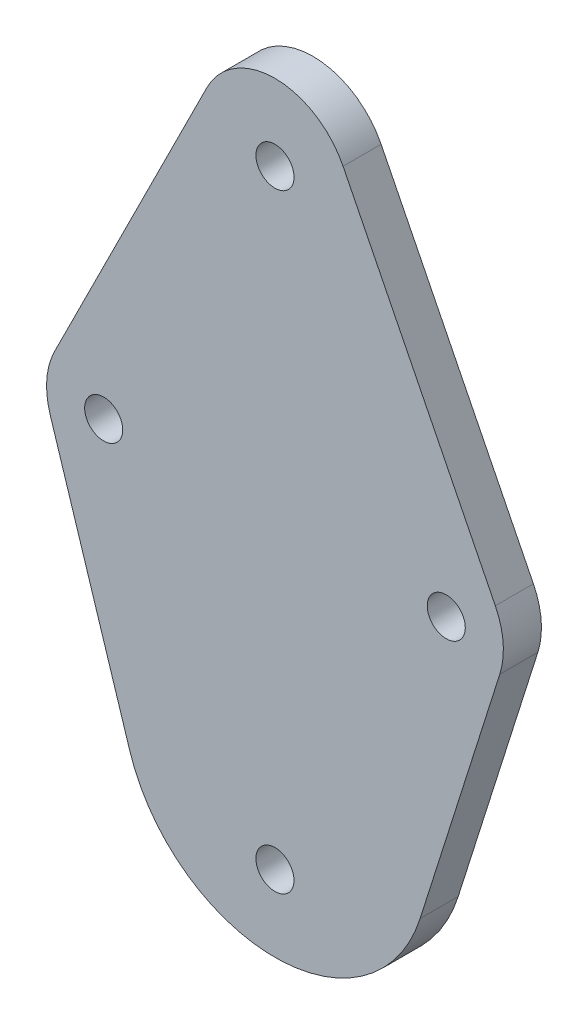
ISO-10303-21;
HEADER;
FILE_DESCRIPTION(('STEP AP214'),'2;1');
FILE_NAME('part.step','',(''),(''),'','','');
FILE_SCHEMA(('AUTOMOTIVE_DESIGN { 1 0 10303 214 1 1 1 1 }'));
ENDSEC;
DATA;
#1=APPLICATION_CONTEXT('core data for automotive mechanical design processes');
#2=APPLICATION_PROTOCOL_DEFINITION('international standard','automotive_design',2000,#1);
#3=PRODUCT_CONTEXT('',#1,'mechanical');
#4=PRODUCT('Part','Part','',(#3));
#5=PRODUCT_RELATED_PRODUCT_CATEGORY('part','',(#4));
#6=PRODUCT_DEFINITION_FORMATION('','',#4);
#7=PRODUCT_DEFINITION_CONTEXT('part definition',#1,'design');
#8=PRODUCT_DEFINITION('design','',#6,#7);
#9=PRODUCT_DEFINITION_SHAPE('','',#8);
#10=(LENGTH_UNIT() NAMED_UNIT(*) SI_UNIT(.MILLI.,.METRE.));
#11=(NAMED_UNIT(*) PLANE_ANGLE_UNIT() SI_UNIT($,.RADIAN.));
#12=(NAMED_UNIT(*) SI_UNIT($,.STERADIAN.) SOLID_ANGLE_UNIT());
#13=UNCERTAINTY_MEASURE_WITH_UNIT(LENGTH_MEASURE(1.E-05),#10,'distance_accuracy_value','');
#14=(GEOMETRIC_REPRESENTATION_CONTEXT(3) GLOBAL_UNCERTAINTY_ASSIGNED_CONTEXT((#13)) GLOBAL_UNIT_ASSIGNED_CONTEXT((#10,
#11,#12)) REPRESENTATION_CONTEXT('',''));
#15=CARTESIAN_POINT('',(0.,0.,0.));
#16=DIRECTION('',(0.,0.,1.));
#17=DIRECTION('',(1.,0.,0.));
#18=AXIS2_PLACEMENT_3D('',#15,#16,#17);
#19=CARTESIAN_POINT('',(0.,40.,5.));
#20=DIRECTION('',(0.,0.,-1.));
#21=DIRECTION('',(-1.,0.,0.));
#22=AXIS2_PLACEMENT_3D('',#19,#20,#21);
#23=CYLINDRICAL_SURFACE('',#22,10.);
#24=CARTESIAN_POINT('',(0.,40.,0.));
#25=DIRECTION('',(0.,0.,1.));
#26=DIRECTION('',(1.,0.,0.));
#27=AXIS2_PLACEMENT_3D('',#24,#25,#26);
#28=CIRCLE('',#27,10.);
#29=CARTESIAN_POINT('',(8.94427190999916,44.4721359549996,0.));
#30=VERTEX_POINT('',#29);
#31=CARTESIAN_POINT('',(-8.94427190999916,44.4721359549996,0.));
#32=VERTEX_POINT('',#31);
#33=EDGE_CURVE('E144',#30,#32,#28,.T.);
#34=ORIENTED_EDGE('',*,*,#33,.T.);
#35=DIRECTION('',(0.,0.,-1.));
#36=VECTOR('',#35,1.);
#37=CARTESIAN_POINT('',(-8.94427190999916,44.4721359549996,5.));
#38=LINE('',#37,#36);
#39=CARTESIAN_POINT('',(-8.94427190999916,44.4721359549996,5.));
#40=VERTEX_POINT('',#39);
#41=EDGE_CURVE('E11',#40,#32,#38,.T.);
#42=ORIENTED_EDGE('',*,*,#41,.F.);
#43=CARTESIAN_POINT('',(0.,40.,5.));
#44=DIRECTION('',(0.,0.,1.));
#45=DIRECTION('',(1.,0.,0.));
#46=AXIS2_PLACEMENT_3D('',#43,#44,#45);
#47=CIRCLE('',#46,10.);
#48=CARTESIAN_POINT('',(8.94427190999916,44.4721359549996,5.));
#49=VERTEX_POINT('',#48);
#50=EDGE_CURVE('E167',#49,#40,#47,.T.);
#51=ORIENTED_EDGE('',*,*,#50,.F.);
#52=DIRECTION('',(0.,0.,-1.));
#53=VECTOR('',#52,1.);
#54=CARTESIAN_POINT('',(8.94427190999916,44.4721359549996,5.));
#55=LINE('',#54,#53);
#56=EDGE_CURVE('E140',#49,#30,#55,.T.);
#57=ORIENTED_EDGE('',*,*,#56,.T.);
#58=EDGE_LOOP('',(#34,#42,#51,#57));
#59=FACE_BOUND('',#58,.T.);
#60=ADVANCED_FACE('F43',(#59),#23,.T.);
#61=CARTESIAN_POINT('',(-8.94427190999916,44.4721359549996,5.));
#62=DIRECTION('',(0.894427190999916,-0.447213595499958,0.));
#63=DIRECTION('',(0.447213595499958,0.894427190999916,0.));
#64=AXIS2_PLACEMENT_3D('',#61,#62,#63);
#65=PLANE('',#64);
#66=DIRECTION('',(-0.447213595499958,-0.894427190999916,0.));
#67=VECTOR('',#66,1.);
#68=CARTESIAN_POINT('',(-8.94427190999916,44.4721359549996,0.));
#69=LINE('',#68,#67);
#70=CARTESIAN_POINT('',(-28.9442719099992,4.47213595499958,0.));
#71=VERTEX_POINT('',#70);
#72=EDGE_CURVE('E148',#32,#71,#69,.T.);
#73=ORIENTED_EDGE('',*,*,#72,.T.);
#74=DIRECTION('',(0.,0.,-1.));
#75=VECTOR('',#74,1.);
#76=CARTESIAN_POINT('',(-28.9442719099992,4.47213595499958,5.));
#77=LINE('',#76,#75);
#78=CARTESIAN_POINT('',(-28.9442719099992,4.47213595499958,5.));
#79=VERTEX_POINT('',#78);
#80=EDGE_CURVE('E52',#79,#71,#77,.T.);
#81=ORIENTED_EDGE('',*,*,#80,.F.);
#82=DIRECTION('',(-0.447213595499958,-0.894427190999916,0.));
#83=VECTOR('',#82,1.);
#84=CARTESIAN_POINT('',(-8.94427190999916,44.4721359549996,5.));
#85=LINE('',#84,#83);
#86=EDGE_CURVE('E103',#40,#79,#85,.T.);
#87=ORIENTED_EDGE('',*,*,#86,.F.);
#88=ORIENTED_EDGE('',*,*,#41,.T.);
#89=EDGE_LOOP('',(#73,#81,#87,#88));
#90=FACE_BOUND('',#89,.T.);
#91=ADVANCED_FACE('F276',(#90),#65,.F.);
#92=CARTESIAN_POINT('',(-20.,0.,5.));
#93=DIRECTION('',(0.,0.,-1.));
#94=DIRECTION('',(-1.,0.,0.));
#95=AXIS2_PLACEMENT_3D('',#92,#93,#94);
#96=CYLINDRICAL_SURFACE('',#95,9.99999999999998);
#97=CARTESIAN_POINT('',(-20.,0.,0.));
#98=DIRECTION('',(0.,0.,1.));
#99=DIRECTION('',(1.,0.,0.));
#100=AXIS2_PLACEMENT_3D('',#97,#98,#99);
#101=CIRCLE('',#100,9.99999999999998);
#102=CARTESIAN_POINT('',(-29.5325421887794,-3.02169479251962,0.));
#103=VERTEX_POINT('',#102);
#104=EDGE_CURVE('E152',#71,#103,#101,.T.);
#105=ORIENTED_EDGE('',*,*,#104,.T.);
#106=DIRECTION('',(0.,0.,-1.));
#107=VECTOR('',#106,1.);
#108=CARTESIAN_POINT('',(-29.5325421887794,-3.02169479251962,5.));
#109=LINE('',#108,#107);
#110=CARTESIAN_POINT('',(-29.5325421887794,-3.02169479251962,5.));
#111=VERTEX_POINT('',#110);
#112=EDGE_CURVE('E178',#111,#103,#109,.T.);
#113=ORIENTED_EDGE('',*,*,#112,.F.);
#114=CARTESIAN_POINT('',(-20.,0.,5.));
#115=DIRECTION('',(0.,0.,1.));
#116=DIRECTION('',(1.,0.,0.));
#117=AXIS2_PLACEMENT_3D('',#114,#115,#116);
#118=CIRCLE('',#117,9.99999999999998);
#119=EDGE_CURVE('E188',#79,#111,#118,.T.);
#120=ORIENTED_EDGE('',*,*,#119,.F.);
#121=ORIENTED_EDGE('',*,*,#80,.T.);
#122=EDGE_LOOP('',(#105,#113,#120,#121));
#123=FACE_BOUND('',#122,.T.);
#124=ADVANCED_FACE('F186',(#123),#96,.T.);
#125=CARTESIAN_POINT('',(-29.5325421887794,-3.02169479251962,5.));
#126=DIRECTION('',(0.953254218877943,0.302169479251962,0.));
#127=DIRECTION('',(-0.302169479251962,0.953254218877943,0.));
#128=AXIS2_PLACEMENT_3D('',#125,#126,#127);
#129=PLANE('',#128);
#130=DIRECTION('',(0.302169479251962,-0.953254218877943,0.));
#131=VECTOR('',#130,1.);
#132=CARTESIAN_POINT('',(-29.5325421887794,-3.02169479251962,0.));
#133=LINE('',#132,#131);
#134=CARTESIAN_POINT('',(-19.0650843775589,-36.0433895850392,0.));
#135=VERTEX_POINT('',#134);
#136=EDGE_CURVE('E155',#103,#135,#133,.T.);
#137=ORIENTED_EDGE('',*,*,#136,.T.);
#138=DIRECTION('',(0.,0.,-1.));
#139=VECTOR('',#138,1.);
#140=CARTESIAN_POINT('',(-19.0650843775589,-36.0433895850392,5.));
#141=LINE('',#140,#139);
#142=CARTESIAN_POINT('',(-19.0650843775589,-36.0433895850392,5.));
#143=VERTEX_POINT('',#142);
#144=EDGE_CURVE('E174',#143,#135,#141,.T.);
#145=ORIENTED_EDGE('',*,*,#144,.F.);
#146=DIRECTION('',(0.302169479251962,-0.953254218877943,0.));
#147=VECTOR('',#146,1.);
#148=CARTESIAN_POINT('',(-29.5325421887794,-3.02169479251962,5.));
#149=LINE('',#148,#147);
#150=EDGE_CURVE('E201',#111,#143,#149,.T.);
#151=ORIENTED_EDGE('',*,*,#150,.F.);
#152=ORIENTED_EDGE('',*,*,#112,.T.);
#153=EDGE_LOOP('',(#137,#145,#151,#152));
#154=FACE_BOUND('',#153,.T.);
#155=ADVANCED_FACE('F196',(#154),#129,.F.);
#156=CARTESIAN_POINT('',(0.,-30.,5.));
#157=DIRECTION('',(0.,0.,-1.));
#158=DIRECTION('',(-1.,0.,0.));
#159=AXIS2_PLACEMENT_3D('',#156,#157,#158);
#160=CYLINDRICAL_SURFACE('',#159,20.);
#161=CARTESIAN_POINT('',(0.,-30.,0.));
#162=DIRECTION('',(0.,0.,1.));
#163=DIRECTION('',(1.,0.,0.));
#164=AXIS2_PLACEMENT_3D('',#161,#162,#163);
#165=CIRCLE('',#164,20.);
#166=CARTESIAN_POINT('',(19.0650843775589,-36.0433895850392,0.));
#167=VERTEX_POINT('',#166);
#168=EDGE_CURVE('E158',#135,#167,#165,.T.);
#169=ORIENTED_EDGE('',*,*,#168,.T.);
#170=DIRECTION('',(0.,0.,-1.));
#171=VECTOR('',#170,1.);
#172=CARTESIAN_POINT('',(19.0650843775589,-36.0433895850392,5.));
#173=LINE('',#172,#171);
#174=CARTESIAN_POINT('',(19.0650843775589,-36.0433895850392,5.));
#175=VERTEX_POINT('',#174);
#176=EDGE_CURVE('E133',#175,#167,#173,.T.);
#177=ORIENTED_EDGE('',*,*,#176,.F.);
#178=CARTESIAN_POINT('',(0.,-30.,5.));
#179=DIRECTION('',(0.,0.,1.));
#180=DIRECTION('',(1.,0.,0.));
#181=AXIS2_PLACEMENT_3D('',#178,#179,#180);
#182=CIRCLE('',#181,20.);
#183=EDGE_CURVE('E122',#143,#175,#182,.T.);
#184=ORIENTED_EDGE('',*,*,#183,.F.);
#185=ORIENTED_EDGE('',*,*,#144,.T.);
#186=EDGE_LOOP('',(#169,#177,#184,#185));
#187=FACE_BOUND('',#186,.T.);
#188=ADVANCED_FACE('F199',(#187),#160,.T.);
#189=CARTESIAN_POINT('',(19.0650843775589,-36.0433895850392,5.));
#190=DIRECTION('',(-0.953254218877943,0.302169479251962,0.));
#191=DIRECTION('',(-0.302169479251962,-0.953254218877943,0.));
#192=AXIS2_PLACEMENT_3D('',#189,#190,#191);
#193=PLANE('',#192);
#194=DIRECTION('',(0.302169479251962,0.953254218877943,0.));
#195=VECTOR('',#194,1.);
#196=CARTESIAN_POINT('',(19.0650843775589,-36.0433895850392,0.));
#197=LINE('',#196,#195);
#198=CARTESIAN_POINT('',(29.5325421887794,-3.02169479251962,0.));
#199=VERTEX_POINT('',#198);
#200=EDGE_CURVE('E131',#167,#199,#197,.T.);
#201=ORIENTED_EDGE('',*,*,#200,.T.);
#202=DIRECTION('',(0.,0.,-1.));
#203=VECTOR('',#202,1.);
#204=CARTESIAN_POINT('',(29.5325421887794,-3.02169479251962,5.));
#205=LINE('',#204,#203);
#206=CARTESIAN_POINT('',(29.5325421887794,-3.02169479251962,5.));
#207=VERTEX_POINT('',#206);
#208=EDGE_CURVE('E128',#207,#199,#205,.T.);
#209=ORIENTED_EDGE('',*,*,#208,.F.);
#210=DIRECTION('',(0.302169479251962,0.953254218877943,0.));
#211=VECTOR('',#210,1.);
#212=CARTESIAN_POINT('',(19.0650843775589,-36.0433895850392,5.));
#213=LINE('',#212,#211);
#214=EDGE_CURVE('E116',#175,#207,#213,.T.);
#215=ORIENTED_EDGE('',*,*,#214,.F.);
#216=ORIENTED_EDGE('',*,*,#176,.T.);
#217=EDGE_LOOP('',(#201,#209,#215,#216));
#218=FACE_BOUND('',#217,.T.);
#219=ADVANCED_FACE('F129',(#218),#193,.F.);
#220=CARTESIAN_POINT('',(20.,0.,5.));
#221=DIRECTION('',(0.,0.,-1.));
#222=DIRECTION('',(-1.,0.,0.));
#223=AXIS2_PLACEMENT_3D('',#220,#221,#222);
#224=CYLINDRICAL_SURFACE('',#223,10.);
#225=CARTESIAN_POINT('',(20.,0.,0.));
#226=DIRECTION('',(0.,0.,1.));
#227=DIRECTION('',(-1.,0.,0.));
#228=AXIS2_PLACEMENT_3D('',#225,#226,#227);
#229=CIRCLE('',#228,10.);
#230=CARTESIAN_POINT('',(28.9442719099992,4.47213595499958,0.));
#231=VERTEX_POINT('',#230);
#232=EDGE_CURVE('E89',#199,#231,#229,.T.);
#233=ORIENTED_EDGE('',*,*,#232,.T.);
#234=DIRECTION('',(0.,0.,-1.));
#235=VECTOR('',#234,1.);
#236=CARTESIAN_POINT('',(28.9442719099992,4.47213595499958,5.));
#237=LINE('',#236,#235);
#238=CARTESIAN_POINT('',(28.9442719099992,4.47213595499958,5.));
#239=VERTEX_POINT('',#238);
#240=EDGE_CURVE('E134',#239,#231,#237,.T.);
#241=ORIENTED_EDGE('',*,*,#240,.F.);
#242=CARTESIAN_POINT('',(20.,0.,5.));
#243=DIRECTION('',(0.,0.,1.));
#244=DIRECTION('',(-1.,0.,0.));
#245=AXIS2_PLACEMENT_3D('',#242,#243,#244);
#246=CIRCLE('',#245,10.);
#247=EDGE_CURVE('E120',#207,#239,#246,.T.);
#248=ORIENTED_EDGE('',*,*,#247,.F.);
#249=ORIENTED_EDGE('',*,*,#208,.T.);
#250=EDGE_LOOP('',(#233,#241,#248,#249));
#251=FACE_BOUND('',#250,.T.);
#252=ADVANCED_FACE('F136',(#251),#224,.T.);
#253=CARTESIAN_POINT('',(28.9442719099992,4.47213595499958,5.));
#254=DIRECTION('',(-0.894427190999916,-0.447213595499958,0.));
#255=DIRECTION('',(0.447213595499958,-0.894427190999916,0.));
#256=AXIS2_PLACEMENT_3D('',#253,#254,#255);
#257=PLANE('',#256);
#258=DIRECTION('',(-0.447213595499958,0.894427190999916,0.));
#259=VECTOR('',#258,1.);
#260=CARTESIAN_POINT('',(28.9442719099992,4.47213595499958,0.));
#261=LINE('',#260,#259);
#262=EDGE_CURVE('E95',#231,#30,#261,.T.);
#263=ORIENTED_EDGE('',*,*,#262,.T.);
#264=ORIENTED_EDGE('',*,*,#56,.F.);
#265=DIRECTION('',(-0.447213595499958,0.894427190999916,0.));
#266=VECTOR('',#265,1.);
#267=CARTESIAN_POINT('',(28.9442719099992,4.47213595499958,5.));
#268=LINE('',#267,#266);
#269=EDGE_CURVE('E60',#239,#49,#268,.T.);
#270=ORIENTED_EDGE('',*,*,#269,.F.);
#271=ORIENTED_EDGE('',*,*,#240,.T.);
#272=EDGE_LOOP('',(#263,#264,#270,#271));
#273=FACE_BOUND('',#272,.T.);
#274=ADVANCED_FACE('F254',(#273),#257,.F.);
#275=CARTESIAN_POINT('',(0.,40.,5.));
#276=DIRECTION('',(0.,0.,1.));
#277=DIRECTION('',(1.,0.,0.));
#278=AXIS2_PLACEMENT_3D('',#275,#276,#277);
#279=PLANE('',#278);
#280=CARTESIAN_POINT('',(0.,40.,5.));
#281=DIRECTION('',(0.,0.,1.));
#282=DIRECTION('',(1.,0.,0.));
#283=AXIS2_PLACEMENT_3D('',#280,#281,#282);
#284=CIRCLE('',#283,2.5);
#285=CARTESIAN_POINT('',(2.5,40.,5.));
#286=VERTEX_POINT('',#285);
#287=EDGE_CURVE('E235',#286,#286,#284,.T.);
#288=ORIENTED_EDGE('',*,*,#287,.F.);
#289=EDGE_LOOP('',(#288));
#290=FACE_BOUND('',#289,.T.);
#291=CARTESIAN_POINT('',(0.,-40.,5.));
#292=DIRECTION('',(0.,0.,1.));
#293=DIRECTION('',(1.,0.,0.));
#294=AXIS2_PLACEMENT_3D('',#291,#292,#293);
#295=CIRCLE('',#294,2.5);
#296=CARTESIAN_POINT('',(2.5,-40.,5.));
#297=VERTEX_POINT('',#296);
#298=EDGE_CURVE('E231',#297,#297,#295,.T.);
#299=ORIENTED_EDGE('',*,*,#298,.F.);
#300=EDGE_LOOP('',(#299));
#301=FACE_BOUND('',#300,.T.);
#302=CARTESIAN_POINT('',(22.5,0.,5.));
#303=DIRECTION('',(0.,0.,1.));
#304=DIRECTION('',(1.,0.,0.));
#305=AXIS2_PLACEMENT_3D('',#302,#303,#304);
#306=CIRCLE('',#305,2.5);
#307=CARTESIAN_POINT('',(25.,0.,5.));
#308=VERTEX_POINT('',#307);
#309=EDGE_CURVE('E223',#308,#308,#306,.T.);
#310=ORIENTED_EDGE('',*,*,#309,.F.);
#311=EDGE_LOOP('',(#310));
#312=FACE_BOUND('',#311,.T.);
#313=CARTESIAN_POINT('',(-22.5,0.,5.));
#314=DIRECTION('',(0.,0.,1.));
#315=DIRECTION('',(1.,0.,0.));
#316=AXIS2_PLACEMENT_3D('',#313,#314,#315);
#317=CIRCLE('',#316,2.5);
#318=CARTESIAN_POINT('',(-20.,0.,5.));
#319=VERTEX_POINT('',#318);
#320=EDGE_CURVE('E215',#319,#319,#317,.T.);
#321=ORIENTED_EDGE('',*,*,#320,.F.);
#322=EDGE_LOOP('',(#321));
#323=FACE_BOUND('',#322,.T.);
#324=ORIENTED_EDGE('',*,*,#50,.T.);
#325=ORIENTED_EDGE('',*,*,#86,.T.);
#326=ORIENTED_EDGE('',*,*,#119,.T.);
#327=ORIENTED_EDGE('',*,*,#150,.T.);
#328=ORIENTED_EDGE('',*,*,#183,.T.);
#329=ORIENTED_EDGE('',*,*,#214,.T.);
#330=ORIENTED_EDGE('',*,*,#247,.T.);
#331=ORIENTED_EDGE('',*,*,#269,.T.);
#332=EDGE_LOOP('',(#324,#325,#326,#327,#328,#329,#330,#331));
#333=FACE_BOUND('',#332,.T.);
#334=ADVANCED_FACE('F118',(#290,#301,#312,#323,#333),#279,.T.);
#335=CARTESIAN_POINT('',(0.,40.,0.));
#336=DIRECTION('',(0.,0.,1.));
#337=DIRECTION('',(1.,0.,0.));
#338=AXIS2_PLACEMENT_3D('',#335,#336,#337);
#339=PLANE('',#338);
#340=CARTESIAN_POINT('',(0.,40.,0.));
#341=DIRECTION('',(0.,0.,1.));
#342=DIRECTION('',(1.,0.,0.));
#343=AXIS2_PLACEMENT_3D('',#340,#341,#342);
#344=CIRCLE('',#343,2.5);
#345=CARTESIAN_POINT('',(2.5,40.,0.));
#346=VERTEX_POINT('',#345);
#347=EDGE_CURVE('E149',#346,#346,#344,.T.);
#348=ORIENTED_EDGE('',*,*,#347,.T.);
#349=EDGE_LOOP('',(#348));
#350=FACE_BOUND('',#349,.T.);
#351=CARTESIAN_POINT('',(0.,-40.,0.));
#352=DIRECTION('',(0.,0.,1.));
#353=DIRECTION('',(1.,0.,0.));
#354=AXIS2_PLACEMENT_3D('',#351,#352,#353);
#355=CIRCLE('',#354,2.5);
#356=CARTESIAN_POINT('',(2.5,-40.,0.));
#357=VERTEX_POINT('',#356);
#358=EDGE_CURVE('E227',#357,#357,#355,.T.);
#359=ORIENTED_EDGE('',*,*,#358,.T.);
#360=EDGE_LOOP('',(#359));
#361=FACE_BOUND('',#360,.T.);
#362=CARTESIAN_POINT('',(22.5,0.,0.));
#363=DIRECTION('',(0.,0.,1.));
#364=DIRECTION('',(1.,0.,0.));
#365=AXIS2_PLACEMENT_3D('',#362,#363,#364);
#366=CIRCLE('',#365,2.5);
#367=CARTESIAN_POINT('',(25.,0.,0.));
#368=VERTEX_POINT('',#367);
#369=EDGE_CURVE('E219',#368,#368,#366,.T.);
#370=ORIENTED_EDGE('',*,*,#369,.T.);
#371=EDGE_LOOP('',(#370));
#372=FACE_BOUND('',#371,.T.);
#373=CARTESIAN_POINT('',(-22.5,0.,0.));
#374=DIRECTION('',(0.,0.,1.));
#375=DIRECTION('',(1.,0.,0.));
#376=AXIS2_PLACEMENT_3D('',#373,#374,#375);
#377=CIRCLE('',#376,2.5);
#378=CARTESIAN_POINT('',(-20.,0.,0.));
#379=VERTEX_POINT('',#378);
#380=EDGE_CURVE('E211',#379,#379,#377,.T.);
#381=ORIENTED_EDGE('',*,*,#380,.T.);
#382=EDGE_LOOP('',(#381));
#383=FACE_BOUND('',#382,.T.);
#384=ORIENTED_EDGE('',*,*,#33,.F.);
#385=ORIENTED_EDGE('',*,*,#262,.F.);
#386=ORIENTED_EDGE('',*,*,#232,.F.);
#387=ORIENTED_EDGE('',*,*,#200,.F.);
#388=ORIENTED_EDGE('',*,*,#168,.F.);
#389=ORIENTED_EDGE('',*,*,#136,.F.);
#390=ORIENTED_EDGE('',*,*,#104,.F.);
#391=ORIENTED_EDGE('',*,*,#72,.F.);
#392=EDGE_LOOP('',(#384,#385,#386,#387,#388,#389,#390,#391));
#393=FACE_BOUND('',#392,.T.);
#394=ADVANCED_FACE('F192',(#350,#361,#372,#383,#393),#339,.F.);
#395=CARTESIAN_POINT('',(-22.5,0.,0.));
#396=DIRECTION('',(0.,0.,1.));
#397=DIRECTION('',(1.,0.,0.));
#398=AXIS2_PLACEMENT_3D('',#395,#396,#397);
#399=CYLINDRICAL_SURFACE('',#398,2.5);
#400=ORIENTED_EDGE('',*,*,#380,.F.);
#401=EDGE_LOOP('',(#400));
#402=FACE_BOUND('',#401,.T.);
#403=ORIENTED_EDGE('',*,*,#320,.T.);
#404=EDGE_LOOP('',(#403));
#405=FACE_BOUND('',#404,.T.);
#406=ADVANCED_FACE('F262',(#402,#405),#399,.F.);
#407=CARTESIAN_POINT('',(22.5,0.,0.));
#408=DIRECTION('',(0.,0.,1.));
#409=DIRECTION('',(1.,0.,0.));
#410=AXIS2_PLACEMENT_3D('',#407,#408,#409);
#411=CYLINDRICAL_SURFACE('',#410,2.5);
#412=ORIENTED_EDGE('',*,*,#369,.F.);
#413=EDGE_LOOP('',(#412));
#414=FACE_BOUND('',#413,.T.);
#415=ORIENTED_EDGE('',*,*,#309,.T.);
#416=EDGE_LOOP('',(#415));
#417=FACE_BOUND('',#416,.T.);
#418=ADVANCED_FACE('F264',(#414,#417),#411,.F.);
#419=CARTESIAN_POINT('',(0.,-40.,0.));
#420=DIRECTION('',(0.,0.,1.));
#421=DIRECTION('',(1.,0.,0.));
#422=AXIS2_PLACEMENT_3D('',#419,#420,#421);
#423=CYLINDRICAL_SURFACE('',#422,2.5);
#424=ORIENTED_EDGE('',*,*,#358,.F.);
#425=EDGE_LOOP('',(#424));
#426=FACE_BOUND('',#425,.T.);
#427=ORIENTED_EDGE('',*,*,#298,.T.);
#428=EDGE_LOOP('',(#427));
#429=FACE_BOUND('',#428,.T.);
#430=ADVANCED_FACE('F248',(#426,#429),#423,.F.);
#431=CARTESIAN_POINT('',(0.,40.,0.));
#432=DIRECTION('',(0.,0.,1.));
#433=DIRECTION('',(1.,0.,0.));
#434=AXIS2_PLACEMENT_3D('',#431,#432,#433);
#435=CYLINDRICAL_SURFACE('',#434,2.5);
#436=ORIENTED_EDGE('',*,*,#347,.F.);
#437=EDGE_LOOP('',(#436));
#438=FACE_BOUND('',#437,.T.);
#439=ORIENTED_EDGE('',*,*,#287,.T.);
#440=EDGE_LOOP('',(#439));
#441=FACE_BOUND('',#440,.T.);
#442=ADVANCED_FACE('F245',(#438,#441),#435,.F.);
#443=CLOSED_SHELL('',(#60,#91,#124,#155,#188,#219,#252,#274,#334,#394,#406,#418,#430,#442));
#444=MANIFOLD_SOLID_BREP('B2',#443);
#445=ADVANCED_BREP_SHAPE_REPRESENTATION('',(#18,#444),#14);
#446=SHAPE_DEFINITION_REPRESENTATION(#9,#445);
ENDSEC;
END-ISO-10303-21;
